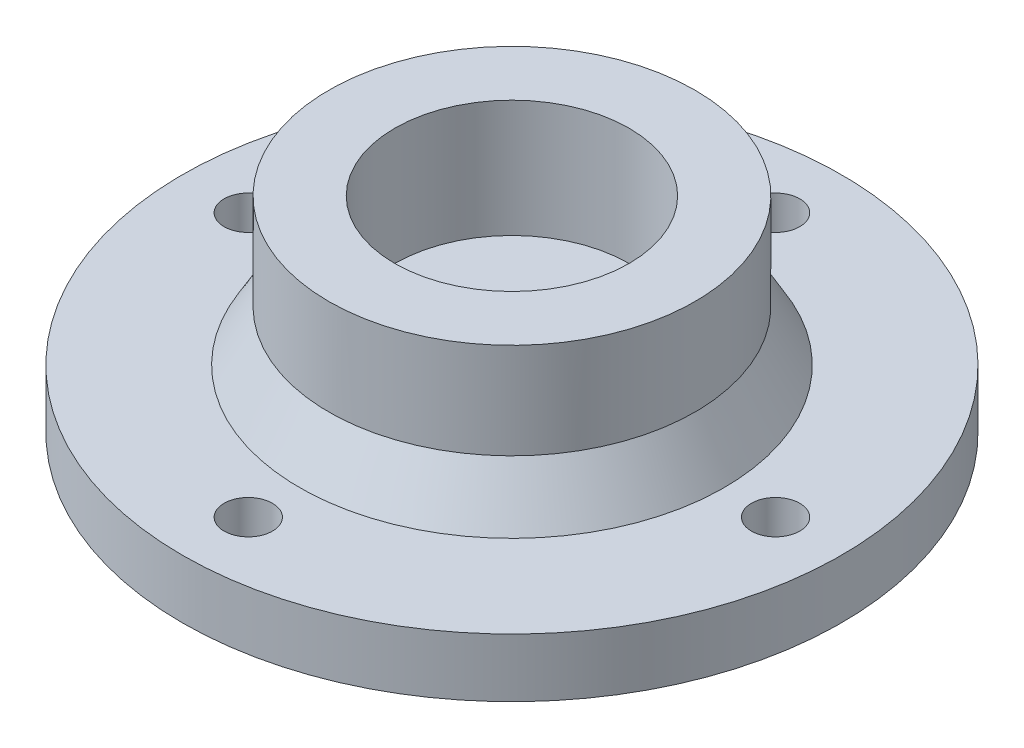
ISO-10303-21;
HEADER;
FILE_DESCRIPTION(('STEP AP214'),'2;1');
FILE_NAME('part.step','',(''),(''),'','','');
FILE_SCHEMA(('AUTOMOTIVE_DESIGN { 1 0 10303 214 1 1 1 1 }'));
ENDSEC;
DATA;
#1=APPLICATION_CONTEXT('core data for automotive mechanical design processes');
#2=APPLICATION_PROTOCOL_DEFINITION('international standard','automotive_design',2000,#1);
#3=PRODUCT_CONTEXT('',#1,'mechanical');
#4=PRODUCT('Part','Part','',(#3));
#5=PRODUCT_RELATED_PRODUCT_CATEGORY('part','',(#4));
#6=PRODUCT_DEFINITION_FORMATION('','',#4);
#7=PRODUCT_DEFINITION_CONTEXT('part definition',#1,'design');
#8=PRODUCT_DEFINITION('design','',#6,#7);
#9=PRODUCT_DEFINITION_SHAPE('','',#8);
#10=(LENGTH_UNIT() NAMED_UNIT(*) SI_UNIT(.MILLI.,.METRE.));
#11=(NAMED_UNIT(*) PLANE_ANGLE_UNIT() SI_UNIT($,.RADIAN.));
#12=(NAMED_UNIT(*) SI_UNIT($,.STERADIAN.) SOLID_ANGLE_UNIT());
#13=UNCERTAINTY_MEASURE_WITH_UNIT(LENGTH_MEASURE(1.E-05),#10,'distance_accuracy_value','');
#14=(GEOMETRIC_REPRESENTATION_CONTEXT(3) GLOBAL_UNCERTAINTY_ASSIGNED_CONTEXT((#13)) GLOBAL_UNIT_ASSIGNED_CONTEXT((#10,
#11,#12)) REPRESENTATION_CONTEXT('',''));
#15=CARTESIAN_POINT('',(0.,0.,0.));
#16=DIRECTION('',(0.,0.,1.));
#17=DIRECTION('',(1.,0.,0.));
#18=AXIS2_PLACEMENT_3D('',#15,#16,#17);
#19=CARTESIAN_POINT('',(0.,4.,0.));
#20=DIRECTION('',(0.,1.,0.));
#21=DIRECTION('',(0.,0.,1.));
#22=AXIS2_PLACEMENT_3D('',#19,#20,#21);
#23=PLANE('',#22);
#24=CARTESIAN_POINT('',(0.,4.,0.));
#25=DIRECTION('',(0.,1.,0.));
#26=DIRECTION('',(0.,0.,1.));
#27=AXIS2_PLACEMENT_3D('',#24,#25,#26);
#28=CIRCLE('',#27,14.5);
#29=CARTESIAN_POINT('',(0.,4.,-14.5));
#30=VERTEX_POINT('',#29);
#31=EDGE_CURVE('E11',#30,#30,#28,.F.);
#32=ORIENTED_EDGE('',*,*,#31,.T.);
#33=EDGE_LOOP('',(#32));
#34=FACE_BOUND('',#33,.T.);
#35=CARTESIAN_POINT('',(0.,4.,-18.));
#36=DIRECTION('',(0.,1.,0.));
#37=DIRECTION('',(0.,0.,1.));
#38=AXIS2_PLACEMENT_3D('',#35,#36,#37);
#39=CIRCLE('',#38,1.65);
#40=CARTESIAN_POINT('',(0.,4.,-16.35));
#41=VERTEX_POINT('',#40);
#42=EDGE_CURVE('E83',#41,#41,#39,.T.);
#43=ORIENTED_EDGE('',*,*,#42,.F.);
#44=EDGE_LOOP('',(#43));
#45=FACE_BOUND('',#44,.T.);
#46=CARTESIAN_POINT('',(-18.,4.,0.));
#47=DIRECTION('',(0.,1.,0.));
#48=DIRECTION('',(0.,0.,1.));
#49=AXIS2_PLACEMENT_3D('',#46,#47,#48);
#50=CIRCLE('',#49,1.65);
#51=CARTESIAN_POINT('',(-18.,4.,1.65));
#52=VERTEX_POINT('',#51);
#53=EDGE_CURVE('E71',#52,#52,#50,.T.);
#54=ORIENTED_EDGE('',*,*,#53,.F.);
#55=EDGE_LOOP('',(#54));
#56=FACE_BOUND('',#55,.T.);
#57=CARTESIAN_POINT('',(0.,4.,0.));
#58=DIRECTION('',(0.,1.,0.));
#59=DIRECTION('',(0.,0.,1.));
#60=AXIS2_PLACEMENT_3D('',#57,#58,#59);
#61=CIRCLE('',#60,22.5);
#62=CARTESIAN_POINT('',(0.,4.,22.5));
#63=VERTEX_POINT('',#62);
#64=EDGE_CURVE('E61',#63,#63,#61,.T.);
#65=ORIENTED_EDGE('',*,*,#64,.T.);
#66=EDGE_LOOP('',(#65));
#67=FACE_BOUND('',#66,.T.);
#68=CARTESIAN_POINT('',(18.,4.,0.));
#69=DIRECTION('',(0.,1.,0.));
#70=DIRECTION('',(0.,0.,1.));
#71=AXIS2_PLACEMENT_3D('',#68,#69,#70);
#72=CIRCLE('',#71,1.65);
#73=CARTESIAN_POINT('',(18.,4.,1.65));
#74=VERTEX_POINT('',#73);
#75=EDGE_CURVE('E77',#74,#74,#72,.T.);
#76=ORIENTED_EDGE('',*,*,#75,.F.);
#77=EDGE_LOOP('',(#76));
#78=FACE_BOUND('',#77,.T.);
#79=CARTESIAN_POINT('',(0.,4.,18.));
#80=DIRECTION('',(0.,1.,0.));
#81=DIRECTION('',(0.,0.,1.));
#82=AXIS2_PLACEMENT_3D('',#79,#80,#81);
#83=CIRCLE('',#82,1.65);
#84=CARTESIAN_POINT('',(0.,4.,19.65));
#85=VERTEX_POINT('',#84);
#86=EDGE_CURVE('E89',#85,#85,#83,.T.);
#87=ORIENTED_EDGE('',*,*,#86,.F.);
#88=EDGE_LOOP('',(#87));
#89=FACE_BOUND('',#88,.T.);
#90=ADVANCED_FACE('F45',(#34,#45,#56,#67,#78,#89),#23,.T.);
#91=CARTESIAN_POINT('',(0.,0.,0.));
#92=DIRECTION('',(0.,1.,0.));
#93=DIRECTION('',(0.,0.,1.));
#94=AXIS2_PLACEMENT_3D('',#91,#92,#93);
#95=PLANE('',#94);
#96=CARTESIAN_POINT('',(0.,0.,0.));
#97=DIRECTION('',(0.,-1.,0.));
#98=DIRECTION('',(0.,0.,-1.));
#99=AXIS2_PLACEMENT_3D('',#96,#97,#98);
#100=CIRCLE('',#99,4.);
#101=CARTESIAN_POINT('',(0.,0.,-4.));
#102=VERTEX_POINT('',#101);
#103=EDGE_CURVE('E104',#102,#102,#100,.T.);
#104=ORIENTED_EDGE('',*,*,#103,.F.);
#105=EDGE_LOOP('',(#104));
#106=FACE_BOUND('',#105,.T.);
#107=CARTESIAN_POINT('',(0.,0.,0.));
#108=DIRECTION('',(0.,1.,0.));
#109=DIRECTION('',(0.,0.,1.));
#110=AXIS2_PLACEMENT_3D('',#107,#108,#109);
#111=CIRCLE('',#110,22.5);
#112=CARTESIAN_POINT('',(0.,0.,22.5));
#113=VERTEX_POINT('',#112);
#114=EDGE_CURVE('E68',#113,#113,#111,.T.);
#115=ORIENTED_EDGE('',*,*,#114,.F.);
#116=EDGE_LOOP('',(#115));
#117=FACE_BOUND('',#116,.T.);
#118=CARTESIAN_POINT('',(-18.,0.,0.));
#119=DIRECTION('',(0.,1.,0.));
#120=DIRECTION('',(0.,0.,1.));
#121=AXIS2_PLACEMENT_3D('',#118,#119,#120);
#122=CIRCLE('',#121,1.65);
#123=CARTESIAN_POINT('',(-18.,0.,1.65));
#124=VERTEX_POINT('',#123);
#125=EDGE_CURVE('E74',#124,#124,#122,.T.);
#126=ORIENTED_EDGE('',*,*,#125,.T.);
#127=EDGE_LOOP('',(#126));
#128=FACE_BOUND('',#127,.T.);
#129=CARTESIAN_POINT('',(18.,0.,0.));
#130=DIRECTION('',(0.,1.,0.));
#131=DIRECTION('',(0.,0.,1.));
#132=AXIS2_PLACEMENT_3D('',#129,#130,#131);
#133=CIRCLE('',#132,1.65);
#134=CARTESIAN_POINT('',(18.,0.,1.65));
#135=VERTEX_POINT('',#134);
#136=EDGE_CURVE('E80',#135,#135,#133,.T.);
#137=ORIENTED_EDGE('',*,*,#136,.T.);
#138=EDGE_LOOP('',(#137));
#139=FACE_BOUND('',#138,.T.);
#140=CARTESIAN_POINT('',(0.,0.,-18.));
#141=DIRECTION('',(0.,1.,0.));
#142=DIRECTION('',(0.,0.,1.));
#143=AXIS2_PLACEMENT_3D('',#140,#141,#142);
#144=CIRCLE('',#143,1.65);
#145=CARTESIAN_POINT('',(0.,0.,-16.35));
#146=VERTEX_POINT('',#145);
#147=EDGE_CURVE('E86',#146,#146,#144,.T.);
#148=ORIENTED_EDGE('',*,*,#147,.T.);
#149=EDGE_LOOP('',(#148));
#150=FACE_BOUND('',#149,.T.);
#151=CARTESIAN_POINT('',(0.,0.,18.));
#152=DIRECTION('',(0.,1.,0.));
#153=DIRECTION('',(0.,0.,1.));
#154=AXIS2_PLACEMENT_3D('',#151,#152,#153);
#155=CIRCLE('',#154,1.65);
#156=CARTESIAN_POINT('',(0.,0.,19.65));
#157=VERTEX_POINT('',#156);
#158=EDGE_CURVE('E92',#157,#157,#155,.T.);
#159=ORIENTED_EDGE('',*,*,#158,.T.);
#160=EDGE_LOOP('',(#159));
#161=FACE_BOUND('',#160,.T.);
#162=ADVANCED_FACE('F129',(#106,#117,#128,#139,#150,#161),#95,.F.);
#163=CARTESIAN_POINT('',(0.,4.,0.));
#164=DIRECTION('',(0.,-1.,0.));
#165=DIRECTION('',(0.,0.,-1.));
#166=AXIS2_PLACEMENT_3D('',#163,#164,#165);
#167=CYLINDRICAL_SURFACE('',#166,22.5);
#168=ORIENTED_EDGE('',*,*,#64,.F.);
#169=EDGE_LOOP('',(#168));
#170=FACE_BOUND('',#169,.T.);
#171=ORIENTED_EDGE('',*,*,#114,.T.);
#172=EDGE_LOOP('',(#171));
#173=FACE_BOUND('',#172,.T.);
#174=ADVANCED_FACE('F132',(#170,#173),#167,.T.);
#175=CARTESIAN_POINT('',(-18.,4.,0.));
#176=DIRECTION('',(0.,-1.,0.));
#177=DIRECTION('',(0.,0.,-1.));
#178=AXIS2_PLACEMENT_3D('',#175,#176,#177);
#179=CYLINDRICAL_SURFACE('',#178,1.65);
#180=ORIENTED_EDGE('',*,*,#53,.T.);
#181=EDGE_LOOP('',(#180));
#182=FACE_BOUND('',#181,.T.);
#183=ORIENTED_EDGE('',*,*,#125,.F.);
#184=EDGE_LOOP('',(#183));
#185=FACE_BOUND('',#184,.T.);
#186=ADVANCED_FACE('F167',(#182,#185),#179,.F.);
#187=CARTESIAN_POINT('',(18.,4.,0.));
#188=DIRECTION('',(0.,-1.,0.));
#189=DIRECTION('',(0.,0.,-1.));
#190=AXIS2_PLACEMENT_3D('',#187,#188,#189);
#191=CYLINDRICAL_SURFACE('',#190,1.65);
#192=ORIENTED_EDGE('',*,*,#75,.T.);
#193=EDGE_LOOP('',(#192));
#194=FACE_BOUND('',#193,.T.);
#195=ORIENTED_EDGE('',*,*,#136,.F.);
#196=EDGE_LOOP('',(#195));
#197=FACE_BOUND('',#196,.T.);
#198=ADVANCED_FACE('F157',(#194,#197),#191,.F.);
#199=CARTESIAN_POINT('',(0.,4.,-18.));
#200=DIRECTION('',(0.,-1.,0.));
#201=DIRECTION('',(0.,0.,-1.));
#202=AXIS2_PLACEMENT_3D('',#199,#200,#201);
#203=CYLINDRICAL_SURFACE('',#202,1.65);
#204=ORIENTED_EDGE('',*,*,#42,.T.);
#205=EDGE_LOOP('',(#204));
#206=FACE_BOUND('',#205,.T.);
#207=ORIENTED_EDGE('',*,*,#147,.F.);
#208=EDGE_LOOP('',(#207));
#209=FACE_BOUND('',#208,.T.);
#210=ADVANCED_FACE('F147',(#206,#209),#203,.F.);
#211=CARTESIAN_POINT('',(0.,4.,18.));
#212=DIRECTION('',(0.,-1.,0.));
#213=DIRECTION('',(0.,0.,-1.));
#214=AXIS2_PLACEMENT_3D('',#211,#212,#213);
#215=CYLINDRICAL_SURFACE('',#214,1.65);
#216=ORIENTED_EDGE('',*,*,#86,.T.);
#217=EDGE_LOOP('',(#216));
#218=FACE_BOUND('',#217,.T.);
#219=ORIENTED_EDGE('',*,*,#158,.F.);
#220=EDGE_LOOP('',(#219));
#221=FACE_BOUND('',#220,.T.);
#222=ADVANCED_FACE('F144',(#218,#221),#215,.F.);
#223=CARTESIAN_POINT('',(0.,14.,0.));
#224=DIRECTION('',(0.,1.,0.));
#225=DIRECTION('',(0.,0.,1.));
#226=AXIS2_PLACEMENT_3D('',#223,#224,#225);
#227=PLANE('',#226);
#228=CARTESIAN_POINT('',(0.,14.,0.));
#229=DIRECTION('',(0.,1.,0.));
#230=DIRECTION('',(0.,0.,1.));
#231=AXIS2_PLACEMENT_3D('',#228,#229,#230);
#232=CIRCLE('',#231,12.5);
#233=CARTESIAN_POINT('',(0.,14.,12.5));
#234=VERTEX_POINT('',#233);
#235=EDGE_CURVE('E95',#234,#234,#232,.T.);
#236=ORIENTED_EDGE('',*,*,#235,.T.);
#237=EDGE_LOOP('',(#236));
#238=FACE_BOUND('',#237,.T.);
#239=CARTESIAN_POINT('',(0.,14.,0.));
#240=DIRECTION('',(0.,1.,0.));
#241=DIRECTION('',(0.,0.,1.));
#242=AXIS2_PLACEMENT_3D('',#239,#240,#241);
#243=CIRCLE('',#242,8.);
#244=CARTESIAN_POINT('',(0.,14.,8.));
#245=VERTEX_POINT('',#244);
#246=EDGE_CURVE('E100',#245,#245,#243,.T.);
#247=ORIENTED_EDGE('',*,*,#246,.F.);
#248=EDGE_LOOP('',(#247));
#249=FACE_BOUND('',#248,.T.);
#250=ADVANCED_FACE('F146',(#238,#249),#227,.T.);
#251=CARTESIAN_POINT('',(0.,14.,0.));
#252=DIRECTION('',(0.,-1.,0.));
#253=DIRECTION('',(0.,0.,-1.));
#254=AXIS2_PLACEMENT_3D('',#251,#252,#253);
#255=CYLINDRICAL_SURFACE('',#254,12.5);
#256=CARTESIAN_POINT('',(0.,7.46410161513781,0.));
#257=DIRECTION('',(0.,1.,0.));
#258=DIRECTION('',(0.,0.,1.));
#259=AXIS2_PLACEMENT_3D('',#256,#257,#258);
#260=CIRCLE('',#259,12.5);
#261=CARTESIAN_POINT('',(0.,7.46410161513781,-12.5));
#262=VERTEX_POINT('',#261);
#263=EDGE_CURVE('E53',#262,#262,#260,.T.);
#264=ORIENTED_EDGE('',*,*,#263,.T.);
#265=EDGE_LOOP('',(#264));
#266=FACE_BOUND('',#265,.T.);
#267=ORIENTED_EDGE('',*,*,#235,.F.);
#268=EDGE_LOOP('',(#267));
#269=FACE_BOUND('',#268,.T.);
#270=ADVANCED_FACE('F154',(#266,#269),#255,.T.);
#271=CARTESIAN_POINT('',(0.,14.,0.));
#272=DIRECTION('',(0.,-1.,0.));
#273=DIRECTION('',(0.,0.,-1.));
#274=AXIS2_PLACEMENT_3D('',#271,#272,#273);
#275=CYLINDRICAL_SURFACE('',#274,8.);
#276=CARTESIAN_POINT('',(0.,6.,0.));
#277=DIRECTION('',(0.,1.,0.));
#278=DIRECTION('',(0.,0.,1.));
#279=AXIS2_PLACEMENT_3D('',#276,#277,#278);
#280=CIRCLE('',#279,8.);
#281=CARTESIAN_POINT('',(0.,6.,8.));
#282=VERTEX_POINT('',#281);
#283=EDGE_CURVE('E57',#282,#282,#280,.T.);
#284=ORIENTED_EDGE('',*,*,#283,.F.);
#285=EDGE_LOOP('',(#284));
#286=FACE_BOUND('',#285,.T.);
#287=ORIENTED_EDGE('',*,*,#246,.T.);
#288=EDGE_LOOP('',(#287));
#289=FACE_BOUND('',#288,.T.);
#290=ADVANCED_FACE('F125',(#286,#289),#275,.F.);
#291=CARTESIAN_POINT('',(0.,3.,0.));
#292=DIRECTION('',(0.,-1.,0.));
#293=DIRECTION('',(0.,0.,-1.));
#294=AXIS2_PLACEMENT_3D('',#291,#292,#293);
#295=CYLINDRICAL_SURFACE('',#294,4.);
#296=CARTESIAN_POINT('',(0.,3.,0.));
#297=DIRECTION('',(0.,-1.,0.));
#298=DIRECTION('',(0.,0.,-1.));
#299=AXIS2_PLACEMENT_3D('',#296,#297,#298);
#300=CIRCLE('',#299,4.);
#301=CARTESIAN_POINT('',(0.,3.,-4.));
#302=VERTEX_POINT('',#301);
#303=EDGE_CURVE('E103',#302,#302,#300,.T.);
#304=ORIENTED_EDGE('',*,*,#303,.F.);
#305=EDGE_LOOP('',(#304));
#306=FACE_BOUND('',#305,.T.);
#307=ORIENTED_EDGE('',*,*,#103,.T.);
#308=EDGE_LOOP('',(#307));
#309=FACE_BOUND('',#308,.T.);
#310=ADVANCED_FACE('F119',(#306,#309),#295,.F.);
#311=CARTESIAN_POINT('',(0.,3.,0.));
#312=DIRECTION('',(0.,-1.,0.));
#313=DIRECTION('',(0.,0.,-1.));
#314=AXIS2_PLACEMENT_3D('',#311,#312,#313);
#315=PLANE('',#314);
#316=CARTESIAN_POINT('',(0.,3.,0.));
#317=DIRECTION('',(0.,-1.,0.));
#318=DIRECTION('',(0.,0.,-1.));
#319=AXIS2_PLACEMENT_3D('',#316,#317,#318);
#320=CIRCLE('',#319,1.6);
#321=CARTESIAN_POINT('',(0.,3.,-1.6));
#322=VERTEX_POINT('',#321);
#323=EDGE_CURVE('E66',#322,#322,#320,.T.);
#324=ORIENTED_EDGE('',*,*,#323,.F.);
#325=EDGE_LOOP('',(#324));
#326=FACE_BOUND('',#325,.T.);
#327=ORIENTED_EDGE('',*,*,#303,.T.);
#328=EDGE_LOOP('',(#327));
#329=FACE_BOUND('',#328,.T.);
#330=ADVANCED_FACE('F115',(#326,#329),#315,.T.);
#331=CARTESIAN_POINT('',(0.,6.,0.));
#332=DIRECTION('',(0.,1.,0.));
#333=DIRECTION('',(0.,0.,1.));
#334=AXIS2_PLACEMENT_3D('',#331,#332,#333);
#335=PLANE('',#334);
#336=CARTESIAN_POINT('',(0.,6.,0.));
#337=DIRECTION('',(0.,1.,0.));
#338=DIRECTION('',(0.,0.,1.));
#339=AXIS2_PLACEMENT_3D('',#336,#337,#338);
#340=CIRCLE('',#339,1.6);
#341=CARTESIAN_POINT('',(0.,6.,1.6));
#342=VERTEX_POINT('',#341);
#343=EDGE_CURVE('E64',#342,#342,#340,.T.);
#344=ORIENTED_EDGE('',*,*,#343,.F.);
#345=EDGE_LOOP('',(#344));
#346=FACE_BOUND('',#345,.T.);
#347=ORIENTED_EDGE('',*,*,#283,.T.);
#348=EDGE_LOOP('',(#347));
#349=FACE_BOUND('',#348,.T.);
#350=ADVANCED_FACE('F118',(#346,#349),#335,.T.);
#351=CARTESIAN_POINT('',(0.,10.,0.));
#352=DIRECTION('',(0.,-1.,0.));
#353=DIRECTION('',(0.,0.,-1.));
#354=AXIS2_PLACEMENT_3D('',#351,#352,#353);
#355=CYLINDRICAL_SURFACE('',#354,1.6);
#356=ORIENTED_EDGE('',*,*,#323,.T.);
#357=EDGE_LOOP('',(#356));
#358=FACE_BOUND('',#357,.T.);
#359=ORIENTED_EDGE('',*,*,#343,.T.);
#360=EDGE_LOOP('',(#359));
#361=FACE_BOUND('',#360,.T.);
#362=ADVANCED_FACE('F112',(#358,#361),#355,.F.);
#363=CARTESIAN_POINT('',(0.,7.46410161513781,0.));
#364=DIRECTION('',(0.,-1.,0.));
#365=DIRECTION('',(0.,0.,-1.));
#366=AXIS2_PLACEMENT_3D('',#363,#364,#365);
#367=CONICAL_SURFACE('',#366,12.5,0.523598775598294);
#368=CARTESIAN_POINT('',(0.,4.,-14.5));
#369=CARTESIAN_POINT('',(0.,4.03608439182435,-14.4791666666667));
#370=CARTESIAN_POINT('',(0.,4.0721687836487,-14.4583333333333));
#371=CARTESIAN_POINT('',(0.,4.14433756729741,-14.4166666666667));
#372=CARTESIAN_POINT('',(0.,4.18042195912176,-14.3958333333333));
#373=CARTESIAN_POINT('',(0.,4.25259074277046,-14.3541666666667));
#374=CARTESIAN_POINT('',(0.,4.28867513459482,-14.3333333333333));
#375=CARTESIAN_POINT('',(0.,4.36084391824352,-14.2916666666667));
#376=CARTESIAN_POINT('',(0.,4.39692831006787,-14.2708333333333));
#377=CARTESIAN_POINT('',(0.,4.46909709371658,-14.2291666666667));
#378=CARTESIAN_POINT('',(0.,4.50518148554093,-14.2083333333333));
#379=CARTESIAN_POINT('',(0.,4.57735026918963,-14.1666666666667));
#380=CARTESIAN_POINT('',(0.,4.61343466101399,-14.1458333333333));
#381=CARTESIAN_POINT('',(0.,4.68560344466269,-14.1041666666667));
#382=CARTESIAN_POINT('',(0.,4.72168783648704,-14.0833333333333));
#383=CARTESIAN_POINT('',(0.,4.79385662013575,-14.0416666666667));
#384=CARTESIAN_POINT('',(0.,4.8299410119601,-14.0208333333333));
#385=CARTESIAN_POINT('',(0.,4.9021097956088,-13.9791666666667));
#386=CARTESIAN_POINT('',(0.,4.93819418743316,-13.9583333333333));
#387=CARTESIAN_POINT('',(0.,5.01036297108186,-13.9166666666667));
#388=CARTESIAN_POINT('',(0.,5.04644736290621,-13.8958333333333));
#389=CARTESIAN_POINT('',(0.,5.11861614655492,-13.8541666666667));
#390=CARTESIAN_POINT('',(0.,5.15470053837927,-13.8333333333333));
#391=CARTESIAN_POINT('',(0.,5.22686932202797,-13.7916666666667));
#392=CARTESIAN_POINT('',(0.,5.26295371385232,-13.7708333333333));
#393=CARTESIAN_POINT('',(0.,5.33512249750103,-13.7291666666667));
#394=CARTESIAN_POINT('',(0.,5.37120688932538,-13.7083333333333));
#395=CARTESIAN_POINT('',(0.,5.44337567297409,-13.6666666666667));
#396=CARTESIAN_POINT('',(0.,5.47946006479844,-13.6458333333333));
#397=CARTESIAN_POINT('',(0.,5.55162884844714,-13.6041666666667));
#398=CARTESIAN_POINT('',(0.,5.58771324027149,-13.5833333333333));
#399=CARTESIAN_POINT('',(0.,5.6598820239202,-13.5416666666667));
#400=CARTESIAN_POINT('',(0.,5.69596641574455,-13.5208333333333));
#401=CARTESIAN_POINT('',(0.,5.76813519939325,-13.4791666666667));
#402=CARTESIAN_POINT('',(0.,5.80421959121761,-13.4583333333333));
#403=CARTESIAN_POINT('',(0.,5.87638837486631,-13.4166666666667));
#404=CARTESIAN_POINT('',(0.,5.91247276669066,-13.3958333333333));
#405=CARTESIAN_POINT('',(0.,5.98464155033937,-13.3541666666667));
#406=CARTESIAN_POINT('',(0.,6.02072594216372,-13.3333333333333));
#407=CARTESIAN_POINT('',(0.,6.09289472581242,-13.2916666666667));
#408=CARTESIAN_POINT('',(0.,6.12897911763678,-13.2708333333333));
#409=CARTESIAN_POINT('',(0.,6.20114790128548,-13.2291666666667));
#410=CARTESIAN_POINT('',(0.,6.23723229310983,-13.2083333333333));
#411=CARTESIAN_POINT('',(0.,6.30940107675854,-13.1666666666667));
#412=CARTESIAN_POINT('',(0.,6.34548546858289,-13.1458333333333));
#413=CARTESIAN_POINT('',(0.,6.41765425223159,-13.1041666666667));
#414=CARTESIAN_POINT('',(0.,6.45373864405594,-13.0833333333333));
#415=CARTESIAN_POINT('',(0.,6.52590742770465,-13.0416666666667));
#416=CARTESIAN_POINT('',(0.,6.561991819529,-13.0208333333333));
#417=CARTESIAN_POINT('',(0.,6.63416060317771,-12.9791666666667));
#418=CARTESIAN_POINT('',(0.,6.67024499500206,-12.9583333333333));
#419=CARTESIAN_POINT('',(0.,6.74241377865076,-12.9166666666667));
#420=CARTESIAN_POINT('',(0.,6.77849817047511,-12.8958333333333));
#421=CARTESIAN_POINT('',(0.,6.85066695412382,-12.8541666666667));
#422=CARTESIAN_POINT('',(0.,6.88675134594817,-12.8333333333333));
#423=CARTESIAN_POINT('',(0.,6.95892012959688,-12.7916666666667));
#424=CARTESIAN_POINT('',(0.,6.99500452142123,-12.7708333333333));
#425=CARTESIAN_POINT('',(0.,7.06717330506993,-12.7291666666667));
#426=CARTESIAN_POINT('',(0.,7.10325769689428,-12.7083333333333));
#427=CARTESIAN_POINT('',(0.,7.17542648054299,-12.6666666666667));
#428=CARTESIAN_POINT('',(0.,7.21151087236734,-12.6458333333333));
#429=CARTESIAN_POINT('',(0.,7.28367965601604,-12.6041666666667));
#430=CARTESIAN_POINT('',(0.,7.3197640478404,-12.5833333333333));
#431=CARTESIAN_POINT('',(0.,7.3919328314891,-12.5416666666667));
#432=CARTESIAN_POINT('',(0.,7.42801722331345,-12.5208333333333));
#433=CARTESIAN_POINT('',(0.,7.46410161513781,-12.5));
#434=B_SPLINE_CURVE_WITH_KNOTS('',3,(#368,#369,#370,#371,#372,#373,#374,#375,#376,#377,#378,
#379,#380,#381,#382,#383,#384,#385,#386,#387,#388,#389,#390,#391,#392,#393,#394,#395,#396,#397,
#398,#399,#400,#401,#402,#403,#404,#405,#406,#407,#408,#409,#410,#411,#412,#413,#414,#415,#416,
#417,#418,#419,#420,#421,#422,#423,#424,#425,#426,#427,#428,#429,#430,#431,#432,#433),
.UNSPECIFIED.,.F.,.F.,(4,2,2,2,2,2,2,2,2,2,2,2,2,2,2,2,2,2,2,2,2,2,2,2,2,2,2,2,2,2,2,2,4),(0.,
0.125000000000001,0.250000000000002,0.375000000000004,0.500000000000005,0.625000000000007,
0.750000000000008,0.875000000000009,1.00000000000001,1.12500000000001,1.25000000000001,
1.37500000000002,1.50000000000002,1.62500000000002,1.75000000000002,1.87500000000002,
2.00000000000002,2.12500000000002,2.25000000000003,2.37500000000003,2.50000000000003,
2.62500000000003,2.75000000000003,2.87500000000003,3.00000000000004,3.12500000000004,
3.25000000000004,3.37500000000004,3.50000000000004,3.62500000000004,3.75000000000005,
3.87500000000005,4.00000000000005),.UNSPECIFIED.);
#435=EDGE_CURVE('BSEAM48',#30,#262,#434,.T.);
#436=ORIENTED_EDGE('',*,*,#31,.F.);
#437=ORIENTED_EDGE('',*,*,#263,.F.);
#438=ORIENTED_EDGE('',*,*,#435,.T.);
#439=ORIENTED_EDGE('',*,*,#435,.F.);
#440=EDGE_LOOP('',(#436,#438,#437,#439));
#441=FACE_BOUND('',#440,.T.);
#442=ADVANCED_FACE('F48',(#441),#367,.T.);
#443=CLOSED_SHELL('',(#90,#162,#174,#186,#198,#210,#222,#250,#270,#290,#310,#330,#350,#362,#442));
#444=MANIFOLD_SOLID_BREP('B2',#443);
#445=ADVANCED_BREP_SHAPE_REPRESENTATION('',(#18,#444),#14);
#446=SHAPE_DEFINITION_REPRESENTATION(#9,#445);
ENDSEC;
END-ISO-10303-21;
